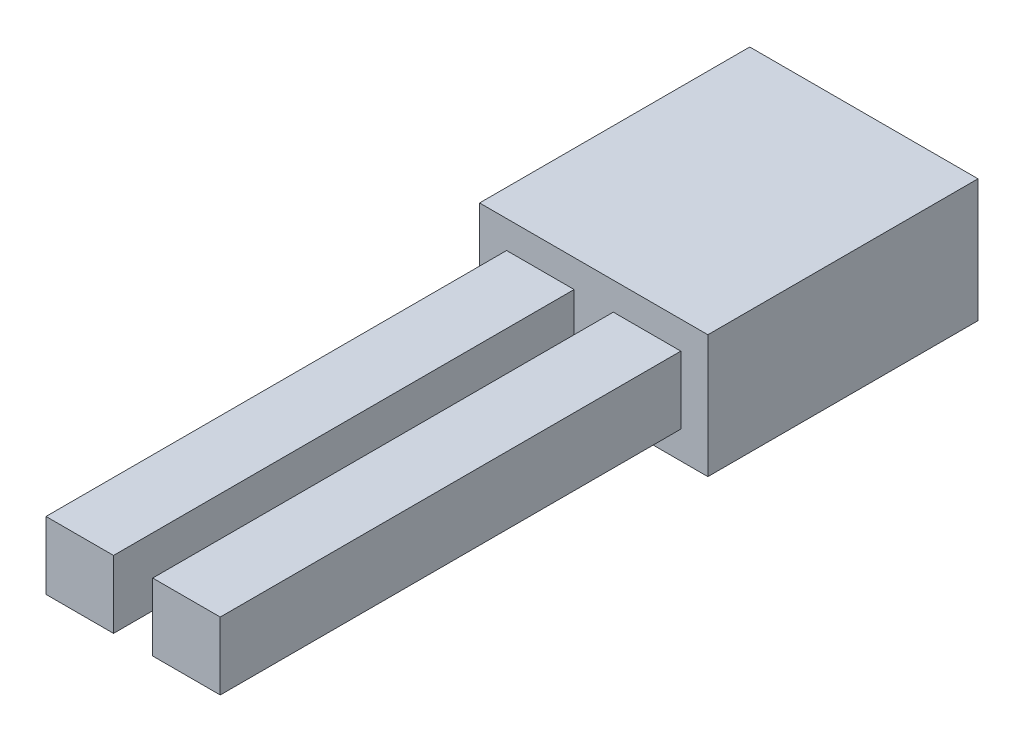
ISO-10303-21;
HEADER;
FILE_DESCRIPTION(('STEP AP214'),'2;1');
FILE_NAME('part.step','',(''),(''),'','','');
FILE_SCHEMA(('AUTOMOTIVE_DESIGN { 1 0 10303 214 1 1 1 1 }'));
ENDSEC;
DATA;
#1=APPLICATION_CONTEXT('core data for automotive mechanical design processes');
#2=APPLICATION_PROTOCOL_DEFINITION('international standard','automotive_design',2000,#1);
#3=PRODUCT_CONTEXT('',#1,'mechanical');
#4=PRODUCT('Part','Part','',(#3));
#5=PRODUCT_RELATED_PRODUCT_CATEGORY('part','',(#4));
#6=PRODUCT_DEFINITION_FORMATION('','',#4);
#7=PRODUCT_DEFINITION_CONTEXT('part definition',#1,'design');
#8=PRODUCT_DEFINITION('design','',#6,#7);
#9=PRODUCT_DEFINITION_SHAPE('','',#8);
#10=(LENGTH_UNIT() NAMED_UNIT(*) SI_UNIT(.MILLI.,.METRE.));
#11=(NAMED_UNIT(*) PLANE_ANGLE_UNIT() SI_UNIT($,.RADIAN.));
#12=(NAMED_UNIT(*) SI_UNIT($,.STERADIAN.) SOLID_ANGLE_UNIT());
#13=UNCERTAINTY_MEASURE_WITH_UNIT(LENGTH_MEASURE(1.E-05),#10,'distance_accuracy_value','');
#14=(GEOMETRIC_REPRESENTATION_CONTEXT(3) GLOBAL_UNCERTAINTY_ASSIGNED_CONTEXT((#13)) GLOBAL_UNIT_ASSIGNED_CONTEXT((#10,
#11,#12)) REPRESENTATION_CONTEXT('',''));
#15=CARTESIAN_POINT('',(0.,0.,0.));
#16=DIRECTION('',(0.,0.,1.));
#17=DIRECTION('',(1.,0.,0.));
#18=AXIS2_PLACEMENT_3D('',#15,#16,#17);
#19=CARTESIAN_POINT('',(0.,1.82,0.));
#20=DIRECTION('',(0.,0.,-1.));
#21=DIRECTION('',(-1.,0.,0.));
#22=AXIS2_PLACEMENT_3D('',#19,#20,#21);
#23=PLANE('',#22);
#24=DIRECTION('',(0.,-1.,0.));
#25=VECTOR('',#24,1.);
#26=CARTESIAN_POINT('',(0.4,1.41,0.));
#27=LINE('',#26,#25);
#28=CARTESIAN_POINT('',(0.4,1.41,0.));
#29=VERTEX_POINT('',#28);
#30=CARTESIAN_POINT('',(0.4,0.41,0.));
#31=VERTEX_POINT('',#30);
#32=EDGE_CURVE('E144',#29,#31,#27,.T.);
#33=ORIENTED_EDGE('',*,*,#32,.F.);
#34=DIRECTION('',(-1.,0.,0.));
#35=VECTOR('',#34,1.);
#36=CARTESIAN_POINT('',(0.4,1.41,0.));
#37=LINE('',#36,#35);
#38=CARTESIAN_POINT('',(1.4,1.41,0.));
#39=VERTEX_POINT('',#38);
#40=EDGE_CURVE('E157',#39,#29,#37,.T.);
#41=ORIENTED_EDGE('',*,*,#40,.F.);
#42=DIRECTION('',(0.,1.,0.));
#43=VECTOR('',#42,1.);
#44=CARTESIAN_POINT('',(1.4,1.41,0.));
#45=LINE('',#44,#43);
#46=CARTESIAN_POINT('',(1.4,0.41,0.));
#47=VERTEX_POINT('',#46);
#48=EDGE_CURVE('E166',#47,#39,#45,.T.);
#49=ORIENTED_EDGE('',*,*,#48,.F.);
#50=DIRECTION('',(1.,0.,0.));
#51=VECTOR('',#50,1.);
#52=CARTESIAN_POINT('',(0.4,0.41,0.));
#53=LINE('',#52,#51);
#54=EDGE_CURVE('E147',#31,#47,#53,.T.);
#55=ORIENTED_EDGE('',*,*,#54,.F.);
#56=EDGE_LOOP('',(#33,#41,#49,#55));
#57=FACE_BOUND('',#56,.T.);
#58=DIRECTION('',(1.,0.,0.));
#59=VECTOR('',#58,1.);
#60=CARTESIAN_POINT('',(0.,0.,0.));
#61=LINE('',#60,#59);
#62=CARTESIAN_POINT('',(0.,0.,0.));
#63=VERTEX_POINT('',#62);
#64=CARTESIAN_POINT('',(3.38,0.,0.));
#65=VERTEX_POINT('',#64);
#66=EDGE_CURVE('E196',#63,#65,#61,.T.);
#67=ORIENTED_EDGE('',*,*,#66,.T.);
#68=DIRECTION('',(0.,-1.,0.));
#69=VECTOR('',#68,1.);
#70=CARTESIAN_POINT('',(3.38,1.82,0.));
#71=LINE('',#70,#69);
#72=CARTESIAN_POINT('',(3.38,1.82,0.));
#73=VERTEX_POINT('',#72);
#74=EDGE_CURVE('E42',#73,#65,#71,.T.);
#75=ORIENTED_EDGE('',*,*,#74,.F.);
#76=DIRECTION('',(1.,0.,0.));
#77=VECTOR('',#76,1.);
#78=CARTESIAN_POINT('',(0.,1.82,0.));
#79=LINE('',#78,#77);
#80=CARTESIAN_POINT('',(0.,1.82,0.));
#81=VERTEX_POINT('',#80);
#82=EDGE_CURVE('E186',#81,#73,#79,.T.);
#83=ORIENTED_EDGE('',*,*,#82,.F.);
#84=DIRECTION('',(0.,-1.,0.));
#85=VECTOR('',#84,1.);
#86=CARTESIAN_POINT('',(0.,1.82,0.));
#87=LINE('',#86,#85);
#88=EDGE_CURVE('E11',#81,#63,#87,.T.);
#89=ORIENTED_EDGE('',*,*,#88,.T.);
#90=EDGE_LOOP('',(#67,#75,#83,#89));
#91=FACE_BOUND('',#90,.T.);
#92=DIRECTION('',(0.,-1.,0.));
#93=VECTOR('',#92,1.);
#94=CARTESIAN_POINT('',(1.98,1.41,0.));
#95=LINE('',#94,#93);
#96=CARTESIAN_POINT('',(1.98,1.41,0.));
#97=VERTEX_POINT('',#96);
#98=CARTESIAN_POINT('',(1.98,0.41,0.));
#99=VERTEX_POINT('',#98);
#100=EDGE_CURVE('E143',#97,#99,#95,.T.);
#101=ORIENTED_EDGE('',*,*,#100,.F.);
#102=DIRECTION('',(-1.,0.,0.));
#103=VECTOR('',#102,1.);
#104=CARTESIAN_POINT('',(1.98,1.41,0.));
#105=LINE('',#104,#103);
#106=CARTESIAN_POINT('',(2.98,1.41,0.));
#107=VERTEX_POINT('',#106);
#108=EDGE_CURVE('E140',#107,#97,#105,.T.);
#109=ORIENTED_EDGE('',*,*,#108,.F.);
#110=DIRECTION('',(0.,1.,0.));
#111=VECTOR('',#110,1.);
#112=CARTESIAN_POINT('',(2.98,1.41,0.));
#113=LINE('',#112,#111);
#114=CARTESIAN_POINT('',(2.98,0.41,0.));
#115=VERTEX_POINT('',#114);
#116=EDGE_CURVE('E54',#115,#107,#113,.T.);
#117=ORIENTED_EDGE('',*,*,#116,.F.);
#118=DIRECTION('',(1.,0.,0.));
#119=VECTOR('',#118,1.);
#120=CARTESIAN_POINT('',(1.98,0.41,0.));
#121=LINE('',#120,#119);
#122=EDGE_CURVE('E49',#99,#115,#121,.T.);
#123=ORIENTED_EDGE('',*,*,#122,.F.);
#124=EDGE_LOOP('',(#101,#109,#117,#123));
#125=FACE_BOUND('',#124,.T.);
#126=ADVANCED_FACE('F34',(#57,#91,#125),#23,.F.);
#127=CARTESIAN_POINT('',(0.,1.82,0.));
#128=DIRECTION('',(1.,0.,0.));
#129=DIRECTION('',(0.,0.,-1.));
#130=AXIS2_PLACEMENT_3D('',#127,#128,#129);
#131=PLANE('',#130);
#132=DIRECTION('',(0.,0.,1.));
#133=VECTOR('',#132,1.);
#134=CARTESIAN_POINT('',(0.,0.,0.));
#135=LINE('',#134,#133);
#136=CARTESIAN_POINT('',(0.,0.,-4.));
#137=VERTEX_POINT('',#136);
#138=EDGE_CURVE('E182',#137,#63,#135,.T.);
#139=ORIENTED_EDGE('',*,*,#138,.T.);
#140=ORIENTED_EDGE('',*,*,#88,.F.);
#141=DIRECTION('',(0.,0.,1.));
#142=VECTOR('',#141,1.);
#143=CARTESIAN_POINT('',(0.,1.82,0.));
#144=LINE('',#143,#142);
#145=CARTESIAN_POINT('',(0.,1.82,-4.));
#146=VERTEX_POINT('',#145);
#147=EDGE_CURVE('E183',#146,#81,#144,.T.);
#148=ORIENTED_EDGE('',*,*,#147,.F.);
#149=DIRECTION('',(0.,-1.,0.));
#150=VECTOR('',#149,1.);
#151=CARTESIAN_POINT('',(0.,1.82,-4.));
#152=LINE('',#151,#150);
#153=EDGE_CURVE('E193',#146,#137,#152,.T.);
#154=ORIENTED_EDGE('',*,*,#153,.T.);
#155=EDGE_LOOP('',(#139,#140,#148,#154));
#156=FACE_BOUND('',#155,.T.);
#157=ADVANCED_FACE('F36',(#156),#131,.F.);
#158=CARTESIAN_POINT('',(3.38,1.82,0.));
#159=DIRECTION('',(-1.,0.,0.));
#160=DIRECTION('',(0.,0.,1.));
#161=AXIS2_PLACEMENT_3D('',#158,#159,#160);
#162=PLANE('',#161);
#163=DIRECTION('',(0.,0.,-1.));
#164=VECTOR('',#163,1.);
#165=CARTESIAN_POINT('',(3.38,0.,0.));
#166=LINE('',#165,#164);
#167=CARTESIAN_POINT('',(3.38,0.,-4.));
#168=VERTEX_POINT('',#167);
#169=EDGE_CURVE('E198',#65,#168,#166,.T.);
#170=ORIENTED_EDGE('',*,*,#169,.T.);
#171=DIRECTION('',(0.,-1.,0.));
#172=VECTOR('',#171,1.);
#173=CARTESIAN_POINT('',(3.38,1.82,-4.));
#174=LINE('',#173,#172);
#175=CARTESIAN_POINT('',(3.38,1.82,-4.));
#176=VERTEX_POINT('',#175);
#177=EDGE_CURVE('E203',#176,#168,#174,.T.);
#178=ORIENTED_EDGE('',*,*,#177,.F.);
#179=DIRECTION('',(0.,0.,-1.));
#180=VECTOR('',#179,1.);
#181=CARTESIAN_POINT('',(3.38,1.82,0.));
#182=LINE('',#181,#180);
#183=EDGE_CURVE('E189',#73,#176,#182,.T.);
#184=ORIENTED_EDGE('',*,*,#183,.F.);
#185=ORIENTED_EDGE('',*,*,#74,.T.);
#186=EDGE_LOOP('',(#170,#178,#184,#185));
#187=FACE_BOUND('',#186,.T.);
#188=ADVANCED_FACE('F210',(#187),#162,.F.);
#189=CARTESIAN_POINT('',(0.,1.82,-4.));
#190=DIRECTION('',(0.,0.,1.));
#191=DIRECTION('',(1.,0.,0.));
#192=AXIS2_PLACEMENT_3D('',#189,#190,#191);
#193=PLANE('',#192);
#194=DIRECTION('',(-1.,0.,0.));
#195=VECTOR('',#194,1.);
#196=CARTESIAN_POINT('',(0.,0.,-4.));
#197=LINE('',#196,#195);
#198=EDGE_CURVE('E187',#168,#137,#197,.T.);
#199=ORIENTED_EDGE('',*,*,#198,.T.);
#200=ORIENTED_EDGE('',*,*,#153,.F.);
#201=DIRECTION('',(-1.,0.,0.));
#202=VECTOR('',#201,1.);
#203=CARTESIAN_POINT('',(0.,1.82,-4.));
#204=LINE('',#203,#202);
#205=EDGE_CURVE('E191',#176,#146,#204,.T.);
#206=ORIENTED_EDGE('',*,*,#205,.F.);
#207=ORIENTED_EDGE('',*,*,#177,.T.);
#208=EDGE_LOOP('',(#199,#200,#206,#207));
#209=FACE_BOUND('',#208,.T.);
#210=ADVANCED_FACE('F219',(#209),#193,.F.);
#211=CARTESIAN_POINT('',(0.,1.82,0.));
#212=DIRECTION('',(0.,-1.,0.));
#213=DIRECTION('',(0.,0.,-1.));
#214=AXIS2_PLACEMENT_3D('',#211,#212,#213);
#215=PLANE('',#214);
#216=ORIENTED_EDGE('',*,*,#147,.T.);
#217=ORIENTED_EDGE('',*,*,#82,.T.);
#218=ORIENTED_EDGE('',*,*,#183,.T.);
#219=ORIENTED_EDGE('',*,*,#205,.T.);
#220=EDGE_LOOP('',(#216,#217,#218,#219));
#221=FACE_BOUND('',#220,.T.);
#222=ADVANCED_FACE('F225',(#221),#215,.F.);
#223=CARTESIAN_POINT('',(0.,0.,0.));
#224=DIRECTION('',(0.,-1.,0.));
#225=DIRECTION('',(0.,0.,-1.));
#226=AXIS2_PLACEMENT_3D('',#223,#224,#225);
#227=PLANE('',#226);
#228=ORIENTED_EDGE('',*,*,#138,.F.);
#229=ORIENTED_EDGE('',*,*,#198,.F.);
#230=ORIENTED_EDGE('',*,*,#169,.F.);
#231=ORIENTED_EDGE('',*,*,#66,.F.);
#232=EDGE_LOOP('',(#228,#229,#230,#231));
#233=FACE_BOUND('',#232,.T.);
#234=ADVANCED_FACE('F216',(#233),#227,.T.);
#235=CARTESIAN_POINT('',(0.4,1.41,6.82));
#236=DIRECTION('',(1.,0.,0.));
#237=DIRECTION('',(0.,1.,0.));
#238=AXIS2_PLACEMENT_3D('',#235,#236,#237);
#239=PLANE('',#238);
#240=ORIENTED_EDGE('',*,*,#32,.T.);
#241=DIRECTION('',(0.,0.,-1.));
#242=VECTOR('',#241,1.);
#243=CARTESIAN_POINT('',(0.4,0.41,6.82));
#244=LINE('',#243,#242);
#245=CARTESIAN_POINT('',(0.4,0.41,6.82));
#246=VERTEX_POINT('',#245);
#247=EDGE_CURVE('E179',#246,#31,#244,.T.);
#248=ORIENTED_EDGE('',*,*,#247,.F.);
#249=DIRECTION('',(0.,-1.,0.));
#250=VECTOR('',#249,1.);
#251=CARTESIAN_POINT('',(0.4,1.41,6.82));
#252=LINE('',#251,#250);
#253=CARTESIAN_POINT('',(0.4,1.41,6.82));
#254=VERTEX_POINT('',#253);
#255=EDGE_CURVE('E153',#254,#246,#252,.T.);
#256=ORIENTED_EDGE('',*,*,#255,.F.);
#257=DIRECTION('',(0.,0.,-1.));
#258=VECTOR('',#257,1.);
#259=CARTESIAN_POINT('',(0.4,1.41,6.82));
#260=LINE('',#259,#258);
#261=EDGE_CURVE('E162',#254,#29,#260,.T.);
#262=ORIENTED_EDGE('',*,*,#261,.T.);
#263=EDGE_LOOP('',(#240,#248,#256,#262));
#264=FACE_BOUND('',#263,.T.);
#265=ADVANCED_FACE('F270',(#264),#239,.F.);
#266=CARTESIAN_POINT('',(0.4,0.41,6.82));
#267=DIRECTION('',(0.,1.,0.));
#268=DIRECTION('',(0.,0.,1.));
#269=AXIS2_PLACEMENT_3D('',#266,#267,#268);
#270=PLANE('',#269);
#271=ORIENTED_EDGE('',*,*,#54,.T.);
#272=DIRECTION('',(0.,0.,-1.));
#273=VECTOR('',#272,1.);
#274=CARTESIAN_POINT('',(1.4,0.41,6.82));
#275=LINE('',#274,#273);
#276=CARTESIAN_POINT('',(1.4,0.41,6.82));
#277=VERTEX_POINT('',#276);
#278=EDGE_CURVE('E176',#277,#47,#275,.T.);
#279=ORIENTED_EDGE('',*,*,#278,.F.);
#280=DIRECTION('',(1.,0.,0.));
#281=VECTOR('',#280,1.);
#282=CARTESIAN_POINT('',(0.4,0.41,6.82));
#283=LINE('',#282,#281);
#284=EDGE_CURVE('E156',#246,#277,#283,.T.);
#285=ORIENTED_EDGE('',*,*,#284,.F.);
#286=ORIENTED_EDGE('',*,*,#247,.T.);
#287=EDGE_LOOP('',(#271,#279,#285,#286));
#288=FACE_BOUND('',#287,.T.);
#289=ADVANCED_FACE('F266',(#288),#270,.F.);
#290=CARTESIAN_POINT('',(1.4,1.41,6.82));
#291=DIRECTION('',(-1.,0.,0.));
#292=DIRECTION('',(0.,-1.,0.));
#293=AXIS2_PLACEMENT_3D('',#290,#291,#292);
#294=PLANE('',#293);
#295=ORIENTED_EDGE('',*,*,#48,.T.);
#296=DIRECTION('',(0.,0.,-1.));
#297=VECTOR('',#296,1.);
#298=CARTESIAN_POINT('',(1.4,1.41,6.82));
#299=LINE('',#298,#297);
#300=CARTESIAN_POINT('',(1.4,1.41,6.82));
#301=VERTEX_POINT('',#300);
#302=EDGE_CURVE('E173',#301,#39,#299,.T.);
#303=ORIENTED_EDGE('',*,*,#302,.F.);
#304=DIRECTION('',(0.,1.,0.));
#305=VECTOR('',#304,1.);
#306=CARTESIAN_POINT('',(1.4,1.41,6.82));
#307=LINE('',#306,#305);
#308=EDGE_CURVE('E159',#277,#301,#307,.T.);
#309=ORIENTED_EDGE('',*,*,#308,.F.);
#310=ORIENTED_EDGE('',*,*,#278,.T.);
#311=EDGE_LOOP('',(#295,#303,#309,#310));
#312=FACE_BOUND('',#311,.T.);
#313=ADVANCED_FACE('F262',(#312),#294,.F.);
#314=CARTESIAN_POINT('',(0.4,1.41,6.82));
#315=DIRECTION('',(0.,-1.,0.));
#316=DIRECTION('',(0.,0.,-1.));
#317=AXIS2_PLACEMENT_3D('',#314,#315,#316);
#318=PLANE('',#317);
#319=ORIENTED_EDGE('',*,*,#40,.T.);
#320=ORIENTED_EDGE('',*,*,#261,.F.);
#321=DIRECTION('',(-1.,0.,0.));
#322=VECTOR('',#321,1.);
#323=CARTESIAN_POINT('',(0.4,1.41,6.82));
#324=LINE('',#323,#322);
#325=EDGE_CURVE('E161',#301,#254,#324,.T.);
#326=ORIENTED_EDGE('',*,*,#325,.F.);
#327=ORIENTED_EDGE('',*,*,#302,.T.);
#328=EDGE_LOOP('',(#319,#320,#326,#327));
#329=FACE_BOUND('',#328,.T.);
#330=ADVANCED_FACE('F258',(#329),#318,.F.);
#331=CARTESIAN_POINT('',(0.,0.,6.82));
#332=DIRECTION('',(0.,0.,1.));
#333=DIRECTION('',(1.,0.,0.));
#334=AXIS2_PLACEMENT_3D('',#331,#332,#333);
#335=PLANE('',#334);
#336=ORIENTED_EDGE('',*,*,#255,.T.);
#337=ORIENTED_EDGE('',*,*,#284,.T.);
#338=ORIENTED_EDGE('',*,*,#308,.T.);
#339=ORIENTED_EDGE('',*,*,#325,.T.);
#340=EDGE_LOOP('',(#336,#337,#338,#339));
#341=FACE_BOUND('',#340,.T.);
#342=ADVANCED_FACE('F255',(#341),#335,.T.);
#343=CARTESIAN_POINT('',(1.98,1.41,6.82));
#344=DIRECTION('',(1.,0.,0.));
#345=DIRECTION('',(0.,0.,-1.));
#346=AXIS2_PLACEMENT_3D('',#343,#344,#345);
#347=PLANE('',#346);
#348=ORIENTED_EDGE('',*,*,#100,.T.);
#349=DIRECTION('',(0.,0.,-1.));
#350=VECTOR('',#349,1.);
#351=CARTESIAN_POINT('',(1.98,0.41,6.82));
#352=LINE('',#351,#350);
#353=CARTESIAN_POINT('',(1.98,0.41,6.82));
#354=VERTEX_POINT('',#353);
#355=EDGE_CURVE('E124',#354,#99,#352,.T.);
#356=ORIENTED_EDGE('',*,*,#355,.F.);
#357=DIRECTION('',(0.,-1.,0.));
#358=VECTOR('',#357,1.);
#359=CARTESIAN_POINT('',(1.98,1.41,6.82));
#360=LINE('',#359,#358);
#361=CARTESIAN_POINT('',(1.98,1.41,6.82));
#362=VERTEX_POINT('',#361);
#363=EDGE_CURVE('E131',#362,#354,#360,.T.);
#364=ORIENTED_EDGE('',*,*,#363,.F.);
#365=DIRECTION('',(0.,0.,-1.));
#366=VECTOR('',#365,1.);
#367=CARTESIAN_POINT('',(1.98,1.41,6.82));
#368=LINE('',#367,#366);
#369=EDGE_CURVE('E233',#362,#97,#368,.T.);
#370=ORIENTED_EDGE('',*,*,#369,.T.);
#371=EDGE_LOOP('',(#348,#356,#364,#370));
#372=FACE_BOUND('',#371,.T.);
#373=ADVANCED_FACE('F142',(#372),#347,.F.);
#374=CARTESIAN_POINT('',(1.98,0.41,6.82));
#375=DIRECTION('',(0.,1.,0.));
#376=DIRECTION('',(0.,0.,1.));
#377=AXIS2_PLACEMENT_3D('',#374,#375,#376);
#378=PLANE('',#377);
#379=ORIENTED_EDGE('',*,*,#122,.T.);
#380=DIRECTION('',(0.,0.,-1.));
#381=VECTOR('',#380,1.);
#382=CARTESIAN_POINT('',(2.98,0.41,6.82));
#383=LINE('',#382,#381);
#384=CARTESIAN_POINT('',(2.98,0.41,6.82));
#385=VERTEX_POINT('',#384);
#386=EDGE_CURVE('E127',#385,#115,#383,.T.);
#387=ORIENTED_EDGE('',*,*,#386,.F.);
#388=DIRECTION('',(1.,0.,0.));
#389=VECTOR('',#388,1.);
#390=CARTESIAN_POINT('',(1.98,0.41,6.82));
#391=LINE('',#390,#389);
#392=EDGE_CURVE('E120',#354,#385,#391,.T.);
#393=ORIENTED_EDGE('',*,*,#392,.F.);
#394=ORIENTED_EDGE('',*,*,#355,.T.);
#395=EDGE_LOOP('',(#379,#387,#393,#394));
#396=FACE_BOUND('',#395,.T.);
#397=ADVANCED_FACE('F122',(#396),#378,.F.);
#398=CARTESIAN_POINT('',(2.98,1.41,6.82));
#399=DIRECTION('',(-1.,0.,0.));
#400=DIRECTION('',(0.,-1.,0.));
#401=AXIS2_PLACEMENT_3D('',#398,#399,#400);
#402=PLANE('',#401);
#403=ORIENTED_EDGE('',*,*,#116,.T.);
#404=DIRECTION('',(0.,0.,-1.));
#405=VECTOR('',#404,1.);
#406=CARTESIAN_POINT('',(2.98,1.41,6.82));
#407=LINE('',#406,#405);
#408=CARTESIAN_POINT('',(2.98,1.41,6.82));
#409=VERTEX_POINT('',#408);
#410=EDGE_CURVE('E149',#409,#107,#407,.T.);
#411=ORIENTED_EDGE('',*,*,#410,.F.);
#412=DIRECTION('',(0.,1.,0.));
#413=VECTOR('',#412,1.);
#414=CARTESIAN_POINT('',(2.98,1.41,6.82));
#415=LINE('',#414,#413);
#416=EDGE_CURVE('E130',#385,#409,#415,.T.);
#417=ORIENTED_EDGE('',*,*,#416,.F.);
#418=ORIENTED_EDGE('',*,*,#386,.T.);
#419=EDGE_LOOP('',(#403,#411,#417,#418));
#420=FACE_BOUND('',#419,.T.);
#421=ADVANCED_FACE('F242',(#420),#402,.F.);
#422=CARTESIAN_POINT('',(1.98,1.41,6.82));
#423=DIRECTION('',(0.,-1.,0.));
#424=DIRECTION('',(0.,0.,-1.));
#425=AXIS2_PLACEMENT_3D('',#422,#423,#424);
#426=PLANE('',#425);
#427=ORIENTED_EDGE('',*,*,#108,.T.);
#428=ORIENTED_EDGE('',*,*,#369,.F.);
#429=DIRECTION('',(-1.,0.,0.));
#430=VECTOR('',#429,1.);
#431=CARTESIAN_POINT('',(1.98,1.41,6.82));
#432=LINE('',#431,#430);
#433=EDGE_CURVE('E136',#409,#362,#432,.T.);
#434=ORIENTED_EDGE('',*,*,#433,.F.);
#435=ORIENTED_EDGE('',*,*,#410,.T.);
#436=EDGE_LOOP('',(#427,#428,#434,#435));
#437=FACE_BOUND('',#436,.T.);
#438=ADVANCED_FACE('F232',(#437),#426,.F.);
#439=CARTESIAN_POINT('',(0.,0.,6.82));
#440=DIRECTION('',(0.,0.,1.));
#441=DIRECTION('',(1.,0.,0.));
#442=AXIS2_PLACEMENT_3D('',#439,#440,#441);
#443=PLANE('',#442);
#444=ORIENTED_EDGE('',*,*,#363,.T.);
#445=ORIENTED_EDGE('',*,*,#392,.T.);
#446=ORIENTED_EDGE('',*,*,#416,.T.);
#447=ORIENTED_EDGE('',*,*,#433,.T.);
#448=EDGE_LOOP('',(#444,#445,#446,#447));
#449=FACE_BOUND('',#448,.T.);
#450=ADVANCED_FACE('F134',(#449),#443,.T.);
#451=CLOSED_SHELL('',(#126,#157,#188,#210,#222,#234,#265,#289,#313,#330,#342,#373,#397,#421,
#438,#450));
#452=MANIFOLD_SOLID_BREP('B2',#451);
#453=ADVANCED_BREP_SHAPE_REPRESENTATION('',(#18,#452),#14);
#454=SHAPE_DEFINITION_REPRESENTATION(#9,#453);
ENDSEC;
END-ISO-10303-21;
